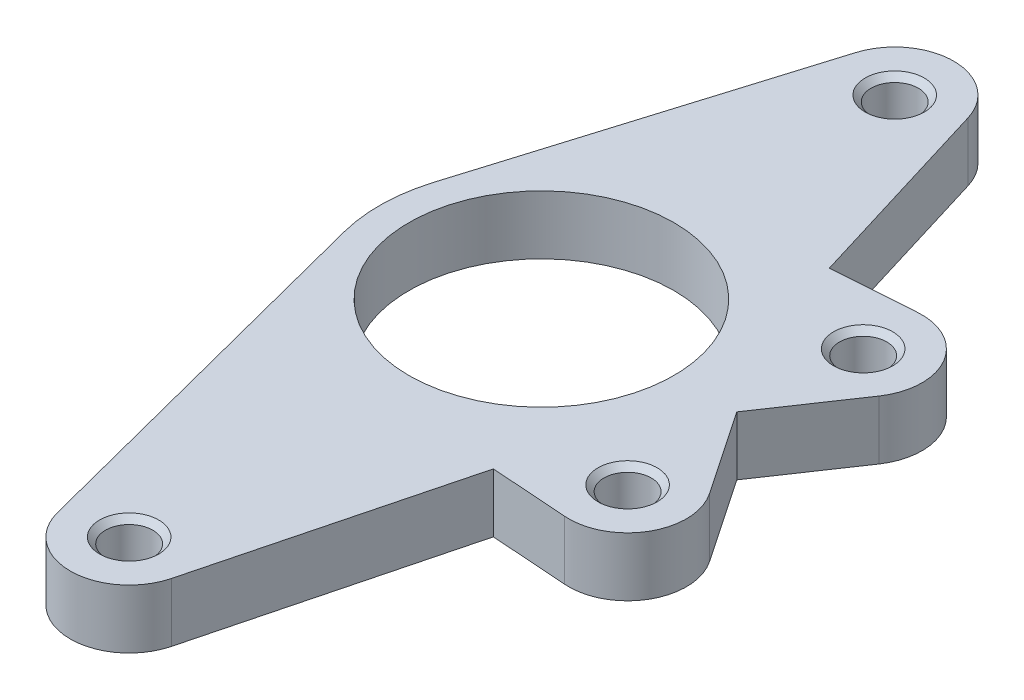
ISO-10303-21;
HEADER;
FILE_DESCRIPTION(('STEP AP214'),'2;1');
FILE_NAME('part.step','',(''),(''),'','','');
FILE_SCHEMA(('AUTOMOTIVE_DESIGN { 1 0 10303 214 1 1 1 1 }'));
ENDSEC;
DATA;
#1=APPLICATION_CONTEXT('core data for automotive mechanical design processes');
#2=APPLICATION_PROTOCOL_DEFINITION('international standard','automotive_design',2000,#1);
#3=PRODUCT_CONTEXT('',#1,'mechanical');
#4=PRODUCT('Part','Part','',(#3));
#5=PRODUCT_RELATED_PRODUCT_CATEGORY('part','',(#4));
#6=PRODUCT_DEFINITION_FORMATION('','',#4);
#7=PRODUCT_DEFINITION_CONTEXT('part definition',#1,'design');
#8=PRODUCT_DEFINITION('design','',#6,#7);
#9=PRODUCT_DEFINITION_SHAPE('','',#8);
#10=(LENGTH_UNIT() NAMED_UNIT(*) SI_UNIT(.MILLI.,.METRE.));
#11=(NAMED_UNIT(*) PLANE_ANGLE_UNIT() SI_UNIT($,.RADIAN.));
#12=(NAMED_UNIT(*) SI_UNIT($,.STERADIAN.) SOLID_ANGLE_UNIT());
#13=UNCERTAINTY_MEASURE_WITH_UNIT(LENGTH_MEASURE(1.E-05),#10,'distance_accuracy_value','');
#14=(GEOMETRIC_REPRESENTATION_CONTEXT(3) GLOBAL_UNCERTAINTY_ASSIGNED_CONTEXT((#13)) GLOBAL_UNIT_ASSIGNED_CONTEXT((#10,
#11,#12)) REPRESENTATION_CONTEXT('',''));
#15=CARTESIAN_POINT('',(0.,0.,0.));
#16=DIRECTION('',(0.,0.,1.));
#17=DIRECTION('',(1.,0.,0.));
#18=AXIS2_PLACEMENT_3D('',#15,#16,#17);
#19=CARTESIAN_POINT('',(0.,6.35,0.));
#20=DIRECTION('',(0.,1.,0.));
#21=DIRECTION('',(0.,0.,1.));
#22=AXIS2_PLACEMENT_3D('',#19,#20,#21);
#23=PLANE('',#22);
#24=CARTESIAN_POINT('',(0.,6.35,44.45));
#25=DIRECTION('',(0.,1.,0.));
#26=DIRECTION('',(0.,0.,1.));
#27=AXIS2_PLACEMENT_3D('',#24,#25,#26);
#28=CIRCLE('',#27,3.1877);
#29=CARTESIAN_POINT('',(0.,6.35,47.6377));
#30=VERTEX_POINT('',#29);
#31=EDGE_CURVE('E342',#30,#30,#28,.T.);
#32=ORIENTED_EDGE('',*,*,#31,.F.);
#33=EDGE_LOOP('',(#32));
#34=FACE_BOUND('',#33,.T.);
#35=CARTESIAN_POINT('',(21.9970452561247,6.35,12.7000000000001));
#36=DIRECTION('',(0.,1.,0.));
#37=DIRECTION('',(0.,0.,1.));
#38=AXIS2_PLACEMENT_3D('',#35,#36,#37);
#39=CIRCLE('',#38,3.1877);
#40=CARTESIAN_POINT('',(21.9970452561247,6.35,15.8877000000001));
#41=VERTEX_POINT('',#40);
#42=EDGE_CURVE('E355',#41,#41,#39,.T.);
#43=ORIENTED_EDGE('',*,*,#42,.F.);
#44=EDGE_LOOP('',(#43));
#45=FACE_BOUND('',#44,.T.);
#46=CARTESIAN_POINT('',(21.9970452561248,6.35,-12.6999999999999));
#47=DIRECTION('',(0.,1.,0.));
#48=DIRECTION('',(0.,0.,1.));
#49=AXIS2_PLACEMENT_3D('',#46,#47,#48);
#50=CIRCLE('',#49,3.1877);
#51=CARTESIAN_POINT('',(21.9970452561248,6.35,-9.51229999999995));
#52=VERTEX_POINT('',#51);
#53=EDGE_CURVE('E367',#52,#52,#50,.T.);
#54=ORIENTED_EDGE('',*,*,#53,.F.);
#55=EDGE_LOOP('',(#54));
#56=FACE_BOUND('',#55,.T.);
#57=CARTESIAN_POINT('',(0.,6.35,-38.1));
#58=DIRECTION('',(0.,1.,0.));
#59=DIRECTION('',(0.,0.,1.));
#60=AXIS2_PLACEMENT_3D('',#57,#58,#59);
#61=CIRCLE('',#60,3.1877);
#62=CARTESIAN_POINT('',(0.,6.35,-34.9123));
#63=VERTEX_POINT('',#62);
#64=EDGE_CURVE('E379',#63,#63,#61,.T.);
#65=ORIENTED_EDGE('',*,*,#64,.F.);
#66=EDGE_LOOP('',(#65));
#67=FACE_BOUND('',#66,.T.);
#68=CARTESIAN_POINT('',(0.,6.35,0.));
#69=DIRECTION('',(0.,1.,0.));
#70=DIRECTION('',(0.,0.,1.));
#71=AXIS2_PLACEMENT_3D('',#68,#69,#70);
#72=CIRCLE('',#71,17.4625);
#73=CARTESIAN_POINT('',(-16.7032309121863,6.35,-5.09322916666666));
#74=VERTEX_POINT('',#73);
#75=CARTESIAN_POINT('',(-16.9079929207868,6.35,4.365625));
#76=VERTEX_POINT('',#75);
#77=EDGE_CURVE('E193',#74,#76,#72,.T.);
#78=ORIENTED_EDGE('',*,*,#77,.T.);
#79=DIRECTION('',(0.25,0.,0.968245836551854));
#80=VECTOR('',#79,1.);
#81=CARTESIAN_POINT('',(-6.14836106210427,6.35,46.0375));
#82=LINE('',#81,#80);
#83=CARTESIAN_POINT('',(-6.14836106210427,6.35,46.0375));
#84=VERTEX_POINT('',#83);
#85=EDGE_CURVE('E116',#76,#84,#82,.T.);
#86=ORIENTED_EDGE('',*,*,#85,.T.);
#87=CARTESIAN_POINT('',(0.,6.35,44.45));
#88=DIRECTION('',(0.,1.,0.));
#89=DIRECTION('',(0.,0.,1.));
#90=AXIS2_PLACEMENT_3D('',#87,#88,#89);
#91=CIRCLE('',#90,6.35);
#92=CARTESIAN_POINT('',(6.14836106210427,6.35,46.0375));
#93=VERTEX_POINT('',#92);
#94=EDGE_CURVE('E223',#84,#93,#91,.T.);
#95=ORIENTED_EDGE('',*,*,#94,.T.);
#96=DIRECTION('',(0.25,0.,-0.968245836551854));
#97=VECTOR('',#96,1.);
#98=CARTESIAN_POINT('',(6.14836106210427,6.35,46.0375));
#99=LINE('',#98,#97);
#100=CARTESIAN_POINT('',(13.2721105037321,6.35,18.447337050021));
#101=VERTEX_POINT('',#100);
#102=EDGE_CURVE('E242',#93,#101,#99,.T.);
#103=ORIENTED_EDGE('',*,*,#102,.T.);
#104=DIRECTION('',(0.997495987148569,0.,0.0707230911548804));
#105=VECTOR('',#104,1.);
#106=CARTESIAN_POINT('',(13.2721105037321,6.35,18.447337050021));
#107=LINE('',#106,#105);
#108=CARTESIAN_POINT('',(21.5479536272912,6.35,19.0340995183935));
#109=VERTEX_POINT('',#108);
#110=EDGE_CURVE('E239',#101,#109,#107,.T.);
#111=ORIENTED_EDGE('',*,*,#110,.T.);
#112=CARTESIAN_POINT('',(21.9970452561247,6.35,12.7000000000001));
#113=DIRECTION('',(0.,1.,0.));
#114=DIRECTION('',(0.,0.,1.));
#115=AXIS2_PLACEMENT_3D('',#112,#113,#114);
#116=CIRCLE('',#115,6.35);
#117=CARTESIAN_POINT('',(27.2579905347354,6.35,9.14402548160671));
#118=VERTEX_POINT('',#117);
#119=EDGE_CURVE('E241',#109,#118,#116,.T.);
#120=ORIENTED_EDGE('',*,*,#119,.T.);
#121=DIRECTION('',(-0.559995987148566,0.,-0.828495319466262));
#122=VECTOR('',#121,1.);
#123=CARTESIAN_POINT('',(27.2579905347354,6.35,9.14402548160671));
#124=LINE('',#123,#122);
#125=CARTESIAN_POINT('',(21.0773671132504,6.35,0.));
#126=VERTEX_POINT('',#125);
#127=EDGE_CURVE('E244',#118,#126,#124,.T.);
#128=ORIENTED_EDGE('',*,*,#127,.T.);
#129=DIRECTION('',(0.559995987148571,0.,-0.828495319466258));
#130=VECTOR('',#129,1.);
#131=CARTESIAN_POINT('',(27.2579905347355,6.35,-9.14402548160653));
#132=LINE('',#131,#130);
#133=CARTESIAN_POINT('',(27.2579905347355,6.35,-9.14402548160653));
#134=VERTEX_POINT('',#133);
#135=EDGE_CURVE('E250',#126,#134,#132,.T.);
#136=ORIENTED_EDGE('',*,*,#135,.T.);
#137=CARTESIAN_POINT('',(21.9970452561248,6.35,-12.7));
#138=DIRECTION('',(0.,1.,0.));
#139=DIRECTION('',(0.,0.,1.));
#140=AXIS2_PLACEMENT_3D('',#137,#138,#139);
#141=CIRCLE('',#140,6.35);
#142=CARTESIAN_POINT('',(21.5479536272913,6.35,-19.0340995183934));
#143=VERTEX_POINT('',#142);
#144=EDGE_CURVE('E252',#134,#143,#141,.T.);
#145=ORIENTED_EDGE('',*,*,#144,.T.);
#146=DIRECTION('',(-0.99749598714857,0.,0.0707230911548736));
#147=VECTOR('',#146,1.);
#148=CARTESIAN_POINT('',(21.5479536272913,6.35,-19.0340995183934));
#149=LINE('',#148,#147);
#150=CARTESIAN_POINT('',(12.6447945481915,6.35,-18.4028599552975));
#151=VERTEX_POINT('',#150);
#152=EDGE_CURVE('E150',#143,#151,#149,.T.);
#153=ORIENTED_EDGE('',*,*,#152,.T.);
#154=DIRECTION('',(-0.291666666666667,0.,-0.956520023604083));
#155=VECTOR('',#154,1.);
#156=CARTESIAN_POINT('',(6.07390214988591,6.35,-39.9520833333333));
#157=LINE('',#156,#155);
#158=CARTESIAN_POINT('',(6.07390214988591,6.35,-39.9520833333333));
#159=VERTEX_POINT('',#158);
#160=EDGE_CURVE('E144',#151,#159,#157,.T.);
#161=ORIENTED_EDGE('',*,*,#160,.T.);
#162=CARTESIAN_POINT('',(0.,6.35,-38.1));
#163=DIRECTION('',(0.,1.,0.));
#164=DIRECTION('',(0.,0.,1.));
#165=AXIS2_PLACEMENT_3D('',#162,#163,#164);
#166=CIRCLE('',#165,6.35);
#167=CARTESIAN_POINT('',(-6.07390214988594,6.35,-39.9520833333333));
#168=VERTEX_POINT('',#167);
#169=EDGE_CURVE('E148',#159,#168,#166,.T.);
#170=ORIENTED_EDGE('',*,*,#169,.T.);
#171=DIRECTION('',(-0.291666666666666,0.,0.956520023604083));
#172=VECTOR('',#171,1.);
#173=CARTESIAN_POINT('',(-16.7032309121863,6.35,-5.09322916666666));
#174=LINE('',#173,#172);
#175=EDGE_CURVE('E58',#168,#74,#174,.T.);
#176=ORIENTED_EDGE('',*,*,#175,.T.);
#177=EDGE_LOOP('',(#78,#86,#95,#103,#111,#120,#128,#136,#145,#153,#161,#170,#176));
#178=FACE_BOUND('',#177,.T.);
#179=CARTESIAN_POINT('',(0.,6.35,0.));
#180=DIRECTION('',(0.,1.,0.));
#181=DIRECTION('',(0.,0.,1.));
#182=AXIS2_PLACEMENT_3D('',#179,#180,#181);
#183=CIRCLE('',#182,14.2875);
#184=CARTESIAN_POINT('',(0.,6.35,14.2875));
#185=VERTEX_POINT('',#184);
#186=EDGE_CURVE('E172',#185,#185,#183,.T.);
#187=ORIENTED_EDGE('',*,*,#186,.F.);
#188=EDGE_LOOP('',(#187));
#189=FACE_BOUND('',#188,.T.);
#190=ADVANCED_FACE('F41',(#34,#45,#56,#67,#178,#189),#23,.T.);
#191=CARTESIAN_POINT('',(0.,0.,0.));
#192=DIRECTION('',(0.,1.,0.));
#193=DIRECTION('',(0.,0.,1.));
#194=AXIS2_PLACEMENT_3D('',#191,#192,#193);
#195=PLANE('',#194);
#196=CARTESIAN_POINT('',(0.,0.,44.45));
#197=DIRECTION('',(0.,1.,0.));
#198=DIRECTION('',(0.,0.,1.));
#199=AXIS2_PLACEMENT_3D('',#196,#197,#198);
#200=CIRCLE('',#199,3.1877);
#201=CARTESIAN_POINT('',(0.,0.,47.6377));
#202=VERTEX_POINT('',#201);
#203=EDGE_CURVE('E343',#202,#202,#200,.T.);
#204=ORIENTED_EDGE('',*,*,#203,.T.);
#205=EDGE_LOOP('',(#204));
#206=FACE_BOUND('',#205,.T.);
#207=CARTESIAN_POINT('',(21.9970452561247,0.,12.7000000000001));
#208=DIRECTION('',(0.,1.,0.));
#209=DIRECTION('',(0.,0.,1.));
#210=AXIS2_PLACEMENT_3D('',#207,#208,#209);
#211=CIRCLE('',#210,3.1877);
#212=CARTESIAN_POINT('',(21.9970452561247,0.,15.8877000000001));
#213=VERTEX_POINT('',#212);
#214=EDGE_CURVE('E352',#213,#213,#211,.T.);
#215=ORIENTED_EDGE('',*,*,#214,.T.);
#216=EDGE_LOOP('',(#215));
#217=FACE_BOUND('',#216,.T.);
#218=CARTESIAN_POINT('',(21.9970452561248,0.,-12.6999999999999));
#219=DIRECTION('',(0.,1.,0.));
#220=DIRECTION('',(0.,0.,1.));
#221=AXIS2_PLACEMENT_3D('',#218,#219,#220);
#222=CIRCLE('',#221,3.1877);
#223=CARTESIAN_POINT('',(21.9970452561248,0.,-9.51229999999995));
#224=VERTEX_POINT('',#223);
#225=EDGE_CURVE('E364',#224,#224,#222,.T.);
#226=ORIENTED_EDGE('',*,*,#225,.T.);
#227=EDGE_LOOP('',(#226));
#228=FACE_BOUND('',#227,.T.);
#229=CARTESIAN_POINT('',(0.,0.,-38.1));
#230=DIRECTION('',(0.,1.,0.));
#231=DIRECTION('',(0.,0.,1.));
#232=AXIS2_PLACEMENT_3D('',#229,#230,#231);
#233=CIRCLE('',#232,3.1877);
#234=CARTESIAN_POINT('',(0.,0.,-34.9123));
#235=VERTEX_POINT('',#234);
#236=EDGE_CURVE('E376',#235,#235,#233,.T.);
#237=ORIENTED_EDGE('',*,*,#236,.T.);
#238=EDGE_LOOP('',(#237));
#239=FACE_BOUND('',#238,.T.);
#240=CARTESIAN_POINT('',(0.,0.,0.));
#241=DIRECTION('',(0.,1.,0.));
#242=DIRECTION('',(0.,0.,1.));
#243=AXIS2_PLACEMENT_3D('',#240,#241,#242);
#244=CIRCLE('',#243,17.4625);
#245=CARTESIAN_POINT('',(-16.7032309121863,0.,-5.09322916666666));
#246=VERTEX_POINT('',#245);
#247=CARTESIAN_POINT('',(-16.9079929207868,0.,4.365625));
#248=VERTEX_POINT('',#247);
#249=EDGE_CURVE('E168',#246,#248,#244,.T.);
#250=ORIENTED_EDGE('',*,*,#249,.F.);
#251=DIRECTION('',(-0.291666666666666,0.,0.956520023604083));
#252=VECTOR('',#251,1.);
#253=CARTESIAN_POINT('',(-16.7032309121863,0.,-5.09322916666666));
#254=LINE('',#253,#252);
#255=CARTESIAN_POINT('',(-6.07390214988594,0.,-39.9520833333333));
#256=VERTEX_POINT('',#255);
#257=EDGE_CURVE('E108',#256,#246,#254,.T.);
#258=ORIENTED_EDGE('',*,*,#257,.F.);
#259=CARTESIAN_POINT('',(0.,0.,-38.1));
#260=DIRECTION('',(0.,1.,0.));
#261=DIRECTION('',(0.,0.,1.));
#262=AXIS2_PLACEMENT_3D('',#259,#260,#261);
#263=CIRCLE('',#262,6.35);
#264=CARTESIAN_POINT('',(6.07390214988591,0.,-39.9520833333333));
#265=VERTEX_POINT('',#264);
#266=EDGE_CURVE('E102',#265,#256,#263,.T.);
#267=ORIENTED_EDGE('',*,*,#266,.F.);
#268=DIRECTION('',(-0.291666666666667,0.,-0.956520023604083));
#269=VECTOR('',#268,1.);
#270=CARTESIAN_POINT('',(6.07390214988591,0.,-39.9520833333333));
#271=LINE('',#270,#269);
#272=CARTESIAN_POINT('',(12.6447945481915,0.,-18.4028599552975));
#273=VERTEX_POINT('',#272);
#274=EDGE_CURVE('E158',#273,#265,#271,.T.);
#275=ORIENTED_EDGE('',*,*,#274,.F.);
#276=DIRECTION('',(-0.99749598714857,0.,0.0707230911548736));
#277=VECTOR('',#276,1.);
#278=CARTESIAN_POINT('',(21.5479536272913,0.,-19.0340995183934));
#279=LINE('',#278,#277);
#280=CARTESIAN_POINT('',(21.5479536272913,0.,-19.0340995183934));
#281=VERTEX_POINT('',#280);
#282=EDGE_CURVE('E188',#281,#273,#279,.T.);
#283=ORIENTED_EDGE('',*,*,#282,.F.);
#284=CARTESIAN_POINT('',(21.9970452561248,0.,-12.7));
#285=DIRECTION('',(0.,1.,0.));
#286=DIRECTION('',(0.,0.,1.));
#287=AXIS2_PLACEMENT_3D('',#284,#285,#286);
#288=CIRCLE('',#287,6.35);
#289=CARTESIAN_POINT('',(27.2579905347355,0.,-9.14402548160653));
#290=VERTEX_POINT('',#289);
#291=EDGE_CURVE('E186',#290,#281,#288,.T.);
#292=ORIENTED_EDGE('',*,*,#291,.F.);
#293=DIRECTION('',(0.559995987148571,0.,-0.828495319466258));
#294=VECTOR('',#293,1.);
#295=CARTESIAN_POINT('',(27.2579905347355,0.,-9.14402548160653));
#296=LINE('',#295,#294);
#297=CARTESIAN_POINT('',(21.0773671132504,0.,0.));
#298=VERTEX_POINT('',#297);
#299=EDGE_CURVE('E184',#298,#290,#296,.T.);
#300=ORIENTED_EDGE('',*,*,#299,.F.);
#301=DIRECTION('',(-0.559995987148566,0.,-0.828495319466262));
#302=VECTOR('',#301,1.);
#303=CARTESIAN_POINT('',(27.2579905347354,0.,9.14402548160671));
#304=LINE('',#303,#302);
#305=CARTESIAN_POINT('',(27.2579905347354,0.,9.14402548160671));
#306=VERTEX_POINT('',#305);
#307=EDGE_CURVE('E182',#306,#298,#304,.T.);
#308=ORIENTED_EDGE('',*,*,#307,.F.);
#309=CARTESIAN_POINT('',(21.9970452561247,0.,12.7000000000001));
#310=DIRECTION('',(0.,1.,0.));
#311=DIRECTION('',(0.,0.,1.));
#312=AXIS2_PLACEMENT_3D('',#309,#310,#311);
#313=CIRCLE('',#312,6.35);
#314=CARTESIAN_POINT('',(21.5479536272912,0.,19.0340995183935));
#315=VERTEX_POINT('',#314);
#316=EDGE_CURVE('E180',#315,#306,#313,.T.);
#317=ORIENTED_EDGE('',*,*,#316,.F.);
#318=DIRECTION('',(0.997495987148569,0.,0.0707230911548804));
#319=VECTOR('',#318,1.);
#320=CARTESIAN_POINT('',(13.2721105037321,0.,18.447337050021));
#321=LINE('',#320,#319);
#322=CARTESIAN_POINT('',(13.2721105037321,0.,18.447337050021));
#323=VERTEX_POINT('',#322);
#324=EDGE_CURVE('E178',#323,#315,#321,.T.);
#325=ORIENTED_EDGE('',*,*,#324,.F.);
#326=DIRECTION('',(0.25,0.,-0.968245836551854));
#327=VECTOR('',#326,1.);
#328=CARTESIAN_POINT('',(6.14836106210427,0.,46.0375));
#329=LINE('',#328,#327);
#330=CARTESIAN_POINT('',(6.14836106210427,0.,46.0375));
#331=VERTEX_POINT('',#330);
#332=EDGE_CURVE('E176',#331,#323,#329,.T.);
#333=ORIENTED_EDGE('',*,*,#332,.F.);
#334=CARTESIAN_POINT('',(0.,0.,44.45));
#335=DIRECTION('',(0.,1.,0.));
#336=DIRECTION('',(0.,0.,1.));
#337=AXIS2_PLACEMENT_3D('',#334,#335,#336);
#338=CIRCLE('',#337,6.35);
#339=CARTESIAN_POINT('',(-6.14836106210427,0.,46.0375));
#340=VERTEX_POINT('',#339);
#341=EDGE_CURVE('E174',#340,#331,#338,.T.);
#342=ORIENTED_EDGE('',*,*,#341,.F.);
#343=DIRECTION('',(0.25,0.,0.968245836551854));
#344=VECTOR('',#343,1.);
#345=CARTESIAN_POINT('',(-6.14836106210427,0.,46.0375));
#346=LINE('',#345,#344);
#347=EDGE_CURVE('E171',#248,#340,#346,.T.);
#348=ORIENTED_EDGE('',*,*,#347,.F.);
#349=EDGE_LOOP('',(#250,#258,#267,#275,#283,#292,#300,#308,#317,#325,#333,#342,#348));
#350=FACE_BOUND('',#349,.T.);
#351=CARTESIAN_POINT('',(0.,0.,0.));
#352=DIRECTION('',(0.,1.,0.));
#353=DIRECTION('',(0.,0.,1.));
#354=AXIS2_PLACEMENT_3D('',#351,#352,#353);
#355=CIRCLE('',#354,14.2875);
#356=CARTESIAN_POINT('',(0.,0.,14.2875));
#357=VERTEX_POINT('',#356);
#358=EDGE_CURVE('E388',#357,#357,#355,.T.);
#359=ORIENTED_EDGE('',*,*,#358,.T.);
#360=EDGE_LOOP('',(#359));
#361=FACE_BOUND('',#360,.T.);
#362=ADVANCED_FACE('F227',(#206,#217,#228,#239,#350,#361),#195,.F.);
#363=CARTESIAN_POINT('',(0.,6.35,0.));
#364=DIRECTION('',(0.,-1.,0.));
#365=DIRECTION('',(0.,0.,-1.));
#366=AXIS2_PLACEMENT_3D('',#363,#364,#365);
#367=CYLINDRICAL_SURFACE('',#366,17.4625);
#368=ORIENTED_EDGE('',*,*,#249,.T.);
#369=DIRECTION('',(0.,-1.,0.));
#370=VECTOR('',#369,1.);
#371=CARTESIAN_POINT('',(-16.9079929207868,6.35,4.365625));
#372=LINE('',#371,#370);
#373=EDGE_CURVE('E11',#76,#248,#372,.T.);
#374=ORIENTED_EDGE('',*,*,#373,.F.);
#375=ORIENTED_EDGE('',*,*,#77,.F.);
#376=DIRECTION('',(0.,-1.,0.));
#377=VECTOR('',#376,1.);
#378=CARTESIAN_POINT('',(-16.7032309121863,6.35,-5.09322916666666));
#379=LINE('',#378,#377);
#380=EDGE_CURVE('E164',#74,#246,#379,.T.);
#381=ORIENTED_EDGE('',*,*,#380,.T.);
#382=EDGE_LOOP('',(#368,#374,#375,#381));
#383=FACE_BOUND('',#382,.T.);
#384=ADVANCED_FACE('F43',(#383),#367,.T.);
#385=CARTESIAN_POINT('',(-6.14836106210427,6.35,46.0375));
#386=DIRECTION('',(0.968245836551854,0.,-0.25));
#387=DIRECTION('',(-0.25,0.,-0.968245836551854));
#388=AXIS2_PLACEMENT_3D('',#385,#386,#387);
#389=PLANE('',#388);
#390=ORIENTED_EDGE('',*,*,#347,.T.);
#391=DIRECTION('',(0.,-1.,0.));
#392=VECTOR('',#391,1.);
#393=CARTESIAN_POINT('',(-6.14836106210427,6.35,46.0375));
#394=LINE('',#393,#392);
#395=EDGE_CURVE('E50',#84,#340,#394,.T.);
#396=ORIENTED_EDGE('',*,*,#395,.F.);
#397=ORIENTED_EDGE('',*,*,#85,.F.);
#398=ORIENTED_EDGE('',*,*,#373,.T.);
#399=EDGE_LOOP('',(#390,#396,#397,#398));
#400=FACE_BOUND('',#399,.T.);
#401=ADVANCED_FACE('F565',(#400),#389,.F.);
#402=CARTESIAN_POINT('',(0.,6.35,44.45));
#403=DIRECTION('',(0.,-1.,0.));
#404=DIRECTION('',(0.,0.,-1.));
#405=AXIS2_PLACEMENT_3D('',#402,#403,#404);
#406=CYLINDRICAL_SURFACE('',#405,6.35);
#407=ORIENTED_EDGE('',*,*,#341,.T.);
#408=DIRECTION('',(0.,-1.,0.));
#409=VECTOR('',#408,1.);
#410=CARTESIAN_POINT('',(6.14836106210427,6.35,46.0375));
#411=LINE('',#410,#409);
#412=EDGE_CURVE('E215',#93,#331,#411,.T.);
#413=ORIENTED_EDGE('',*,*,#412,.F.);
#414=ORIENTED_EDGE('',*,*,#94,.F.);
#415=ORIENTED_EDGE('',*,*,#395,.T.);
#416=EDGE_LOOP('',(#407,#413,#414,#415));
#417=FACE_BOUND('',#416,.T.);
#418=ADVANCED_FACE('F221',(#417),#406,.T.);
#419=CARTESIAN_POINT('',(6.14836106210427,6.35,46.0375));
#420=DIRECTION('',(-0.968245836551854,0.,-0.25));
#421=DIRECTION('',(-0.25,0.,0.968245836551854));
#422=AXIS2_PLACEMENT_3D('',#419,#420,#421);
#423=PLANE('',#422);
#424=ORIENTED_EDGE('',*,*,#332,.T.);
#425=DIRECTION('',(0.,-1.,0.));
#426=VECTOR('',#425,1.);
#427=CARTESIAN_POINT('',(13.2721105037321,6.35,18.447337050021));
#428=LINE('',#427,#426);
#429=EDGE_CURVE('E212',#101,#323,#428,.T.);
#430=ORIENTED_EDGE('',*,*,#429,.F.);
#431=ORIENTED_EDGE('',*,*,#102,.F.);
#432=ORIENTED_EDGE('',*,*,#412,.T.);
#433=EDGE_LOOP('',(#424,#430,#431,#432));
#434=FACE_BOUND('',#433,.T.);
#435=ADVANCED_FACE('F233',(#434),#423,.F.);
#436=CARTESIAN_POINT('',(13.2721105037321,6.35,18.447337050021));
#437=DIRECTION('',(0.0707230911548804,0.,-0.997495987148569));
#438=DIRECTION('',(-0.997495987148569,0.,-0.0707230911548804));
#439=AXIS2_PLACEMENT_3D('',#436,#437,#438);
#440=PLANE('',#439);
#441=ORIENTED_EDGE('',*,*,#324,.T.);
#442=DIRECTION('',(0.,-1.,0.));
#443=VECTOR('',#442,1.);
#444=CARTESIAN_POINT('',(21.5479536272912,6.35,19.0340995183935));
#445=LINE('',#444,#443);
#446=EDGE_CURVE('E209',#109,#315,#445,.T.);
#447=ORIENTED_EDGE('',*,*,#446,.F.);
#448=ORIENTED_EDGE('',*,*,#110,.F.);
#449=ORIENTED_EDGE('',*,*,#429,.T.);
#450=EDGE_LOOP('',(#441,#447,#448,#449));
#451=FACE_BOUND('',#450,.T.);
#452=ADVANCED_FACE('F237',(#451),#440,.F.);
#453=CARTESIAN_POINT('',(21.9970452561247,6.35,12.7000000000001));
#454=DIRECTION('',(0.,-1.,0.));
#455=DIRECTION('',(0.,0.,-1.));
#456=AXIS2_PLACEMENT_3D('',#453,#454,#455);
#457=CYLINDRICAL_SURFACE('',#456,6.35);
#458=ORIENTED_EDGE('',*,*,#316,.T.);
#459=DIRECTION('',(0.,-1.,0.));
#460=VECTOR('',#459,1.);
#461=CARTESIAN_POINT('',(27.2579905347354,6.35,9.14402548160671));
#462=LINE('',#461,#460);
#463=EDGE_CURVE('E206',#118,#306,#462,.T.);
#464=ORIENTED_EDGE('',*,*,#463,.F.);
#465=ORIENTED_EDGE('',*,*,#119,.F.);
#466=ORIENTED_EDGE('',*,*,#446,.T.);
#467=EDGE_LOOP('',(#458,#464,#465,#466));
#468=FACE_BOUND('',#467,.T.);
#469=ADVANCED_FACE('F530',(#468),#457,.T.);
#470=CARTESIAN_POINT('',(27.2579905347354,6.35,9.14402548160671));
#471=DIRECTION('',(-0.828495319466262,0.,0.559995987148566));
#472=DIRECTION('',(0.559995987148566,0.,0.828495319466262));
#473=AXIS2_PLACEMENT_3D('',#470,#471,#472);
#474=PLANE('',#473);
#475=ORIENTED_EDGE('',*,*,#307,.T.);
#476=DIRECTION('',(0.,-1.,0.));
#477=VECTOR('',#476,1.);
#478=CARTESIAN_POINT('',(21.0773671132504,6.35,0.));
#479=LINE('',#478,#477);
#480=EDGE_CURVE('E203',#126,#298,#479,.T.);
#481=ORIENTED_EDGE('',*,*,#480,.F.);
#482=ORIENTED_EDGE('',*,*,#127,.F.);
#483=ORIENTED_EDGE('',*,*,#463,.T.);
#484=EDGE_LOOP('',(#475,#481,#482,#483));
#485=FACE_BOUND('',#484,.T.);
#486=ADVANCED_FACE('F520',(#485),#474,.F.);
#487=CARTESIAN_POINT('',(27.2579905347355,6.35,-9.14402548160653));
#488=DIRECTION('',(-0.828495319466258,0.,-0.559995987148571));
#489=DIRECTION('',(-0.559995987148571,0.,0.828495319466259));
#490=AXIS2_PLACEMENT_3D('',#487,#488,#489);
#491=PLANE('',#490);
#492=ORIENTED_EDGE('',*,*,#299,.T.);
#493=DIRECTION('',(0.,-1.,0.));
#494=VECTOR('',#493,1.);
#495=CARTESIAN_POINT('',(27.2579905347355,6.35,-9.14402548160653));
#496=LINE('',#495,#494);
#497=EDGE_CURVE('E200',#134,#290,#496,.T.);
#498=ORIENTED_EDGE('',*,*,#497,.F.);
#499=ORIENTED_EDGE('',*,*,#135,.F.);
#500=ORIENTED_EDGE('',*,*,#480,.T.);
#501=EDGE_LOOP('',(#492,#498,#499,#500));
#502=FACE_BOUND('',#501,.T.);
#503=ADVANCED_FACE('F511',(#502),#491,.F.);
#504=CARTESIAN_POINT('',(21.9970452561248,6.35,-12.7));
#505=DIRECTION('',(0.,-1.,0.));
#506=DIRECTION('',(0.,0.,-1.));
#507=AXIS2_PLACEMENT_3D('',#504,#505,#506);
#508=CYLINDRICAL_SURFACE('',#507,6.35);
#509=ORIENTED_EDGE('',*,*,#291,.T.);
#510=DIRECTION('',(0.,-1.,0.));
#511=VECTOR('',#510,1.);
#512=CARTESIAN_POINT('',(21.5479536272913,6.35,-19.0340995183934));
#513=LINE('',#512,#511);
#514=EDGE_CURVE('E197',#143,#281,#513,.T.);
#515=ORIENTED_EDGE('',*,*,#514,.F.);
#516=ORIENTED_EDGE('',*,*,#144,.F.);
#517=ORIENTED_EDGE('',*,*,#497,.T.);
#518=EDGE_LOOP('',(#509,#515,#516,#517));
#519=FACE_BOUND('',#518,.T.);
#520=ADVANCED_FACE('F258',(#519),#508,.T.);
#521=CARTESIAN_POINT('',(21.5479536272913,6.35,-19.0340995183934));
#522=DIRECTION('',(0.0707230911548736,0.,0.99749598714857));
#523=DIRECTION('',(0.99749598714857,0.,-0.0707230911548737));
#524=AXIS2_PLACEMENT_3D('',#521,#522,#523);
#525=PLANE('',#524);
#526=ORIENTED_EDGE('',*,*,#282,.T.);
#527=DIRECTION('',(0.,-1.,0.));
#528=VECTOR('',#527,1.);
#529=CARTESIAN_POINT('',(12.6447945481915,6.35,-18.4028599552975));
#530=LINE('',#529,#528);
#531=EDGE_CURVE('E159',#151,#273,#530,.T.);
#532=ORIENTED_EDGE('',*,*,#531,.F.);
#533=ORIENTED_EDGE('',*,*,#152,.F.);
#534=ORIENTED_EDGE('',*,*,#514,.T.);
#535=EDGE_LOOP('',(#526,#532,#533,#534));
#536=FACE_BOUND('',#535,.T.);
#537=ADVANCED_FACE('F262',(#536),#525,.F.);
#538=CARTESIAN_POINT('',(6.07390214988591,6.35,-39.9520833333333));
#539=DIRECTION('',(-0.956520023604083,0.,0.291666666666667));
#540=DIRECTION('',(0.291666666666667,0.,0.956520023604083));
#541=AXIS2_PLACEMENT_3D('',#538,#539,#540);
#542=PLANE('',#541);
#543=ORIENTED_EDGE('',*,*,#274,.T.);
#544=DIRECTION('',(0.,-1.,0.));
#545=VECTOR('',#544,1.);
#546=CARTESIAN_POINT('',(6.07390214988591,6.35,-39.9520833333333));
#547=LINE('',#546,#545);
#548=EDGE_CURVE('E155',#159,#265,#547,.T.);
#549=ORIENTED_EDGE('',*,*,#548,.F.);
#550=ORIENTED_EDGE('',*,*,#160,.F.);
#551=ORIENTED_EDGE('',*,*,#531,.T.);
#552=EDGE_LOOP('',(#543,#549,#550,#551));
#553=FACE_BOUND('',#552,.T.);
#554=ADVANCED_FACE('F156',(#553),#542,.F.);
#555=CARTESIAN_POINT('',(0.,6.35,-38.1));
#556=DIRECTION('',(0.,-1.,0.));
#557=DIRECTION('',(0.,0.,-1.));
#558=AXIS2_PLACEMENT_3D('',#555,#556,#557);
#559=CYLINDRICAL_SURFACE('',#558,6.35);
#560=ORIENTED_EDGE('',*,*,#266,.T.);
#561=DIRECTION('',(0.,-1.,0.));
#562=VECTOR('',#561,1.);
#563=CARTESIAN_POINT('',(-6.07390214988594,6.35,-39.9520833333333));
#564=LINE('',#563,#562);
#565=EDGE_CURVE('E160',#168,#256,#564,.T.);
#566=ORIENTED_EDGE('',*,*,#565,.F.);
#567=ORIENTED_EDGE('',*,*,#169,.F.);
#568=ORIENTED_EDGE('',*,*,#548,.T.);
#569=EDGE_LOOP('',(#560,#566,#567,#568));
#570=FACE_BOUND('',#569,.T.);
#571=ADVANCED_FACE('F162',(#570),#559,.T.);
#572=CARTESIAN_POINT('',(-16.7032309121863,6.35,-5.09322916666666));
#573=DIRECTION('',(0.956520023604083,0.,0.291666666666666));
#574=DIRECTION('',(0.291666666666666,0.,-0.956520023604083));
#575=AXIS2_PLACEMENT_3D('',#572,#573,#574);
#576=PLANE('',#575);
#577=ORIENTED_EDGE('',*,*,#257,.T.);
#578=ORIENTED_EDGE('',*,*,#380,.F.);
#579=ORIENTED_EDGE('',*,*,#175,.F.);
#580=ORIENTED_EDGE('',*,*,#565,.T.);
#581=EDGE_LOOP('',(#577,#578,#579,#580));
#582=FACE_BOUND('',#581,.T.);
#583=ADVANCED_FACE('F266',(#582),#576,.F.);
#584=CARTESIAN_POINT('',(0.,6.35,0.));
#585=DIRECTION('',(0.,-1.,0.));
#586=DIRECTION('',(0.,0.,-1.));
#587=AXIS2_PLACEMENT_3D('',#584,#585,#586);
#588=CYLINDRICAL_SURFACE('',#587,14.2875);
#589=ORIENTED_EDGE('',*,*,#186,.T.);
#590=EDGE_LOOP('',(#589));
#591=FACE_BOUND('',#590,.T.);
#592=ORIENTED_EDGE('',*,*,#358,.F.);
#593=EDGE_LOOP('',(#592));
#594=FACE_BOUND('',#593,.T.);
#595=ADVANCED_FACE('F268',(#591,#594),#588,.F.);
#596=CARTESIAN_POINT('',(0.,0.635000000000003,-38.1));
#597=DIRECTION('',(0.,-1.,0.));
#598=DIRECTION('',(0.,0.,-1.));
#599=AXIS2_PLACEMENT_3D('',#596,#597,#598);
#600=CONICAL_SURFACE('',#599,2.5527,0.785398163397447);
#601=ORIENTED_EDGE('',*,*,#236,.F.);
#602=EDGE_LOOP('',(#601));
#603=FACE_BOUND('',#602,.T.);
#604=CARTESIAN_POINT('',(0.,0.635000000000003,-38.1));
#605=DIRECTION('',(0.,1.,0.));
#606=DIRECTION('',(0.,0.,1.));
#607=AXIS2_PLACEMENT_3D('',#604,#605,#606);
#608=CIRCLE('',#607,2.5527);
#609=CARTESIAN_POINT('',(0.,0.635000000000003,-35.5473));
#610=VERTEX_POINT('',#609);
#611=EDGE_CURVE('E385',#610,#610,#608,.T.);
#612=ORIENTED_EDGE('',*,*,#611,.T.);
#613=EDGE_LOOP('',(#612));
#614=FACE_BOUND('',#613,.T.);
#615=ADVANCED_FACE('F274',(#603,#614),#600,.F.);
#616=CARTESIAN_POINT('',(0.,6.35,-38.1));
#617=DIRECTION('',(0.,1.,0.));
#618=DIRECTION('',(0.,0.,1.));
#619=AXIS2_PLACEMENT_3D('',#616,#617,#618);
#620=CYLINDRICAL_SURFACE('',#619,2.55269999999999);
#621=ORIENTED_EDGE('',*,*,#611,.F.);
#622=EDGE_LOOP('',(#621));
#623=FACE_BOUND('',#622,.T.);
#624=CARTESIAN_POINT('',(0.,5.71499999999999,-38.1));
#625=DIRECTION('',(0.,1.,0.));
#626=DIRECTION('',(0.,0.,1.));
#627=AXIS2_PLACEMENT_3D('',#624,#625,#626);
#628=CIRCLE('',#627,2.55269999999999);
#629=CARTESIAN_POINT('',(0.,5.71499999999999,-35.5473));
#630=VERTEX_POINT('',#629);
#631=EDGE_CURVE('E382',#630,#630,#628,.T.);
#632=ORIENTED_EDGE('',*,*,#631,.T.);
#633=EDGE_LOOP('',(#632));
#634=FACE_BOUND('',#633,.T.);
#635=ADVANCED_FACE('F291',(#623,#634),#620,.F.);
#636=CARTESIAN_POINT('',(0.,6.35,-38.1));
#637=DIRECTION('',(0.,1.,0.));
#638=DIRECTION('',(0.,0.,1.));
#639=AXIS2_PLACEMENT_3D('',#636,#637,#638);
#640=CONICAL_SURFACE('',#639,3.1877,0.785398163397448);
#641=ORIENTED_EDGE('',*,*,#631,.F.);
#642=EDGE_LOOP('',(#641));
#643=FACE_BOUND('',#642,.T.);
#644=ORIENTED_EDGE('',*,*,#64,.T.);
#645=EDGE_LOOP('',(#644));
#646=FACE_BOUND('',#645,.T.);
#647=ADVANCED_FACE('F295',(#643,#646),#640,.F.);
#648=CARTESIAN_POINT('',(21.9970452561248,0.635000000000003,-12.6999999999999));
#649=DIRECTION('',(0.,-1.,0.));
#650=DIRECTION('',(0.,0.,-1.));
#651=AXIS2_PLACEMENT_3D('',#648,#649,#650);
#652=CONICAL_SURFACE('',#651,2.5527,0.785398163397447);
#653=ORIENTED_EDGE('',*,*,#225,.F.);
#654=EDGE_LOOP('',(#653));
#655=FACE_BOUND('',#654,.T.);
#656=CARTESIAN_POINT('',(21.9970452561248,0.635000000000003,-12.6999999999999));
#657=DIRECTION('',(0.,1.,0.));
#658=DIRECTION('',(0.,0.,1.));
#659=AXIS2_PLACEMENT_3D('',#656,#657,#658);
#660=CIRCLE('',#659,2.5527);
#661=CARTESIAN_POINT('',(21.9970452561248,0.635000000000003,-10.1473));
#662=VERTEX_POINT('',#661);
#663=EDGE_CURVE('E373',#662,#662,#660,.T.);
#664=ORIENTED_EDGE('',*,*,#663,.T.);
#665=EDGE_LOOP('',(#664));
#666=FACE_BOUND('',#665,.T.);
#667=ADVANCED_FACE('F299',(#655,#666),#652,.F.);
#668=CARTESIAN_POINT('',(21.9970452561248,6.35,-12.6999999999999));
#669=DIRECTION('',(0.,1.,0.));
#670=DIRECTION('',(0.,0.,1.));
#671=AXIS2_PLACEMENT_3D('',#668,#669,#670);
#672=CYLINDRICAL_SURFACE('',#671,2.55269999999999);
#673=ORIENTED_EDGE('',*,*,#663,.F.);
#674=EDGE_LOOP('',(#673));
#675=FACE_BOUND('',#674,.T.);
#676=CARTESIAN_POINT('',(21.9970452561248,5.71499999999999,-12.6999999999999));
#677=DIRECTION('',(0.,1.,0.));
#678=DIRECTION('',(0.,0.,1.));
#679=AXIS2_PLACEMENT_3D('',#676,#677,#678);
#680=CIRCLE('',#679,2.55269999999999);
#681=CARTESIAN_POINT('',(21.9970452561248,5.71499999999999,-10.1473));
#682=VERTEX_POINT('',#681);
#683=EDGE_CURVE('E370',#682,#682,#680,.T.);
#684=ORIENTED_EDGE('',*,*,#683,.T.);
#685=EDGE_LOOP('',(#684));
#686=FACE_BOUND('',#685,.T.);
#687=ADVANCED_FACE('F303',(#675,#686),#672,.F.);
#688=CARTESIAN_POINT('',(21.9970452561248,6.35,-12.6999999999999));
#689=DIRECTION('',(0.,1.,0.));
#690=DIRECTION('',(0.,0.,1.));
#691=AXIS2_PLACEMENT_3D('',#688,#689,#690);
#692=CONICAL_SURFACE('',#691,3.1877,0.78539816339745);
#693=ORIENTED_EDGE('',*,*,#683,.F.);
#694=EDGE_LOOP('',(#693));
#695=FACE_BOUND('',#694,.T.);
#696=ORIENTED_EDGE('',*,*,#53,.T.);
#697=EDGE_LOOP('',(#696));
#698=FACE_BOUND('',#697,.T.);
#699=ADVANCED_FACE('F307',(#695,#698),#692,.F.);
#700=CARTESIAN_POINT('',(21.9970452561247,0.635000000000003,12.7000000000001));
#701=DIRECTION('',(0.,-1.,0.));
#702=DIRECTION('',(0.,0.,-1.));
#703=AXIS2_PLACEMENT_3D('',#700,#701,#702);
#704=CONICAL_SURFACE('',#703,2.5527,0.785398163397447);
#705=ORIENTED_EDGE('',*,*,#214,.F.);
#706=EDGE_LOOP('',(#705));
#707=FACE_BOUND('',#706,.T.);
#708=CARTESIAN_POINT('',(21.9970452561247,0.635000000000003,12.7000000000001));
#709=DIRECTION('',(0.,1.,0.));
#710=DIRECTION('',(0.,0.,1.));
#711=AXIS2_PLACEMENT_3D('',#708,#709,#710);
#712=CIRCLE('',#711,2.5527);
#713=CARTESIAN_POINT('',(21.9970452561247,0.635000000000003,15.2527000000001));
#714=VERTEX_POINT('',#713);
#715=EDGE_CURVE('E361',#714,#714,#712,.T.);
#716=ORIENTED_EDGE('',*,*,#715,.T.);
#717=EDGE_LOOP('',(#716));
#718=FACE_BOUND('',#717,.T.);
#719=ADVANCED_FACE('F311',(#707,#718),#704,.F.);
#720=CARTESIAN_POINT('',(21.9970452561247,6.35,12.7000000000001));
#721=DIRECTION('',(0.,1.,0.));
#722=DIRECTION('',(0.,0.,1.));
#723=AXIS2_PLACEMENT_3D('',#720,#721,#722);
#724=CYLINDRICAL_SURFACE('',#723,2.55269999999999);
#725=ORIENTED_EDGE('',*,*,#715,.F.);
#726=EDGE_LOOP('',(#725));
#727=FACE_BOUND('',#726,.T.);
#728=CARTESIAN_POINT('',(21.9970452561247,5.71499999999999,12.7000000000001));
#729=DIRECTION('',(0.,1.,0.));
#730=DIRECTION('',(0.,0.,1.));
#731=AXIS2_PLACEMENT_3D('',#728,#729,#730);
#732=CIRCLE('',#731,2.55269999999999);
#733=CARTESIAN_POINT('',(21.9970452561247,5.71499999999999,15.2527000000001));
#734=VERTEX_POINT('',#733);
#735=EDGE_CURVE('E358',#734,#734,#732,.T.);
#736=ORIENTED_EDGE('',*,*,#735,.T.);
#737=EDGE_LOOP('',(#736));
#738=FACE_BOUND('',#737,.T.);
#739=ADVANCED_FACE('F315',(#727,#738),#724,.F.);
#740=CARTESIAN_POINT('',(21.9970452561247,6.35,12.7000000000001));
#741=DIRECTION('',(0.,1.,0.));
#742=DIRECTION('',(0.,0.,1.));
#743=AXIS2_PLACEMENT_3D('',#740,#741,#742);
#744=CONICAL_SURFACE('',#743,3.1877,0.78539816339745);
#745=ORIENTED_EDGE('',*,*,#735,.F.);
#746=EDGE_LOOP('',(#745));
#747=FACE_BOUND('',#746,.T.);
#748=ORIENTED_EDGE('',*,*,#42,.T.);
#749=EDGE_LOOP('',(#748));
#750=FACE_BOUND('',#749,.T.);
#751=ADVANCED_FACE('F319',(#747,#750),#744,.F.);
#752=CARTESIAN_POINT('',(0.,0.635000000000003,44.45));
#753=DIRECTION('',(0.,-1.,0.));
#754=DIRECTION('',(0.,0.,-1.));
#755=AXIS2_PLACEMENT_3D('',#752,#753,#754);
#756=CONICAL_SURFACE('',#755,2.5527,0.785398163397447);
#757=ORIENTED_EDGE('',*,*,#203,.F.);
#758=EDGE_LOOP('',(#757));
#759=FACE_BOUND('',#758,.T.);
#760=CARTESIAN_POINT('',(0.,0.635000000000003,44.45));
#761=DIRECTION('',(0.,1.,0.));
#762=DIRECTION('',(0.,0.,1.));
#763=AXIS2_PLACEMENT_3D('',#760,#761,#762);
#764=CIRCLE('',#763,2.5527);
#765=CARTESIAN_POINT('',(0.,0.635000000000003,47.0027));
#766=VERTEX_POINT('',#765);
#767=EDGE_CURVE('E345',#766,#766,#764,.T.);
#768=ORIENTED_EDGE('',*,*,#767,.T.);
#769=EDGE_LOOP('',(#768));
#770=FACE_BOUND('',#769,.T.);
#771=ADVANCED_FACE('F323',(#759,#770),#756,.F.);
#772=CARTESIAN_POINT('',(0.,6.35,44.45));
#773=DIRECTION('',(0.,1.,0.));
#774=DIRECTION('',(0.,0.,1.));
#775=AXIS2_PLACEMENT_3D('',#772,#773,#774);
#776=CYLINDRICAL_SURFACE('',#775,2.55269999999999);
#777=ORIENTED_EDGE('',*,*,#767,.F.);
#778=EDGE_LOOP('',(#777));
#779=FACE_BOUND('',#778,.T.);
#780=CARTESIAN_POINT('',(0.,5.71499999999999,44.45));
#781=DIRECTION('',(0.,1.,0.));
#782=DIRECTION('',(0.,0.,1.));
#783=AXIS2_PLACEMENT_3D('',#780,#781,#782);
#784=CIRCLE('',#783,2.55269999999999);
#785=CARTESIAN_POINT('',(0.,5.71499999999999,47.0027));
#786=VERTEX_POINT('',#785);
#787=EDGE_CURVE('E340',#786,#786,#784,.T.);
#788=ORIENTED_EDGE('',*,*,#787,.T.);
#789=EDGE_LOOP('',(#788));
#790=FACE_BOUND('',#789,.T.);
#791=ADVANCED_FACE('F327',(#779,#790),#776,.F.);
#792=CARTESIAN_POINT('',(0.,6.35,44.45));
#793=DIRECTION('',(0.,1.,0.));
#794=DIRECTION('',(0.,0.,1.));
#795=AXIS2_PLACEMENT_3D('',#792,#793,#794);
#796=CONICAL_SURFACE('',#795,3.1877,0.785398163397448);
#797=ORIENTED_EDGE('',*,*,#787,.F.);
#798=EDGE_LOOP('',(#797));
#799=FACE_BOUND('',#798,.T.);
#800=ORIENTED_EDGE('',*,*,#31,.T.);
#801=EDGE_LOOP('',(#800));
#802=FACE_BOUND('',#801,.T.);
#803=ADVANCED_FACE('F331',(#799,#802),#796,.F.);
#804=CLOSED_SHELL('',(#190,#362,#384,#401,#418,#435,#452,#469,#486,#503,#520,#537,#554,#571,
#583,#595,#615,#635,#647,#667,#687,#699,#719,#739,#751,#771,#791,#803));
#805=MANIFOLD_SOLID_BREP('B2',#804);
#806=ADVANCED_BREP_SHAPE_REPRESENTATION('',(#18,#805),#14);
#807=SHAPE_DEFINITION_REPRESENTATION(#9,#806);
ENDSEC;
END-ISO-10303-21;
